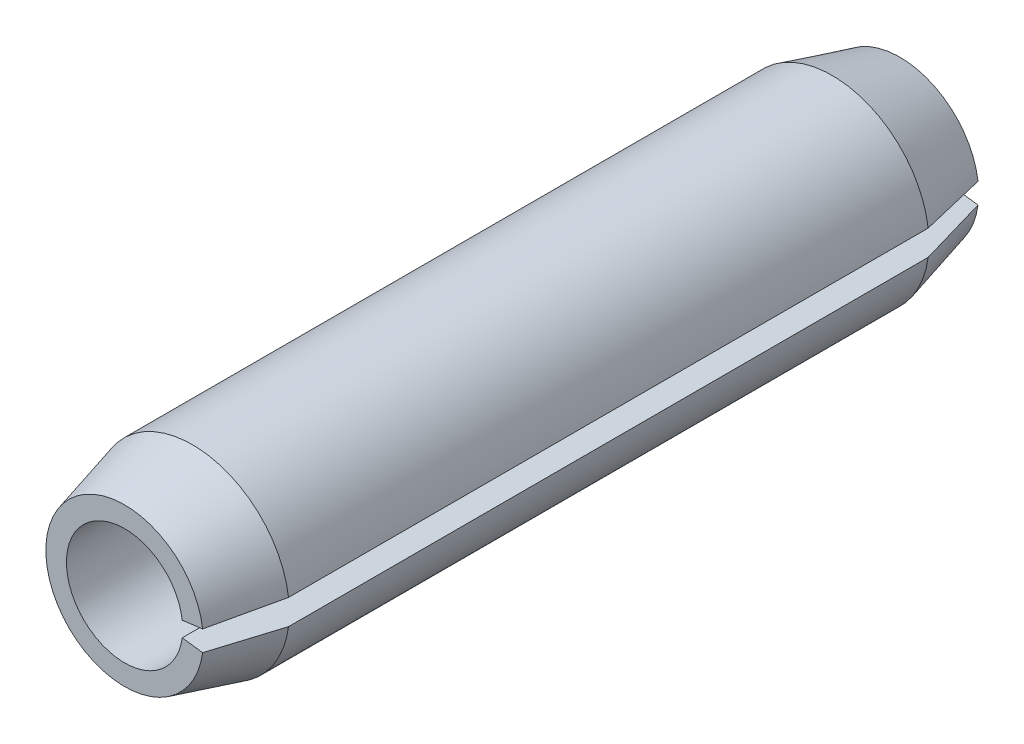
ISO-10303-21;
HEADER;
FILE_DESCRIPTION(('STEP AP214'),'2;1');
FILE_NAME('part.step','',(''),(''),'','','');
FILE_SCHEMA(('AUTOMOTIVE_DESIGN { 1 0 10303 214 1 1 1 1 }'));
ENDSEC;
DATA;
#1=APPLICATION_CONTEXT('core data for automotive mechanical design processes');
#2=APPLICATION_PROTOCOL_DEFINITION('international standard','automotive_design',2000,#1);
#3=PRODUCT_CONTEXT('',#1,'mechanical');
#4=PRODUCT('Part','Part','',(#3));
#5=PRODUCT_RELATED_PRODUCT_CATEGORY('part','',(#4));
#6=PRODUCT_DEFINITION_FORMATION('','',#4);
#7=PRODUCT_DEFINITION_CONTEXT('part definition',#1,'design');
#8=PRODUCT_DEFINITION('design','',#6,#7);
#9=PRODUCT_DEFINITION_SHAPE('','',#8);
#10=(LENGTH_UNIT() NAMED_UNIT(*) SI_UNIT(.MILLI.,.METRE.));
#11=(NAMED_UNIT(*) PLANE_ANGLE_UNIT() SI_UNIT($,.RADIAN.));
#12=(NAMED_UNIT(*) SI_UNIT($,.STERADIAN.) SOLID_ANGLE_UNIT());
#13=UNCERTAINTY_MEASURE_WITH_UNIT(LENGTH_MEASURE(1.E-05),#10,'distance_accuracy_value','');
#14=(GEOMETRIC_REPRESENTATION_CONTEXT(3) GLOBAL_UNCERTAINTY_ASSIGNED_CONTEXT((#13)) GLOBAL_UNIT_ASSIGNED_CONTEXT((#10,
#11,#12)) REPRESENTATION_CONTEXT('',''));
#15=CARTESIAN_POINT('',(0.,0.,0.));
#16=DIRECTION('',(0.,0.,1.));
#17=DIRECTION('',(1.,0.,0.));
#18=AXIS2_PLACEMENT_3D('',#15,#16,#17);
#19=CARTESIAN_POINT('',(0.,0.,2.));
#20=DIRECTION('',(0.,0.,1.));
#21=DIRECTION('',(1.,0.,0.));
#22=AXIS2_PLACEMENT_3D('',#19,#20,#21);
#23=PLANE('',#22);
#24=DIRECTION('',(0.991444861373811,-0.130526192220048,0.));
#25=VECTOR('',#24,1.);
#26=CARTESIAN_POINT('',(0.,0.,2.));
#27=LINE('',#26,#25);
#28=CARTESIAN_POINT('',(0.297433458412143,-0.0391578576660145,2.));
#29=VERTEX_POINT('',#28);
#30=CARTESIAN_POINT('',(0.402742533206121,-0.0530220603812592,2.));
#31=VERTEX_POINT('',#30);
#32=EDGE_CURVE('E43',#29,#31,#27,.T.);
#33=ORIENTED_EDGE('',*,*,#32,.F.);
#34=CARTESIAN_POINT('',(0.,0.,2.));
#35=DIRECTION('',(0.,0.,1.));
#36=DIRECTION('',(1.,0.,0.));
#37=AXIS2_PLACEMENT_3D('',#34,#35,#36);
#38=CIRCLE('',#37,0.3);
#39=CARTESIAN_POINT('',(0.297433458412143,0.0391578576660145,2.));
#40=VERTEX_POINT('',#39);
#41=EDGE_CURVE('E94',#40,#29,#38,.T.);
#42=ORIENTED_EDGE('',*,*,#41,.F.);
#43=DIRECTION('',(-0.991444861373811,-0.130526192220048,0.));
#44=VECTOR('',#43,1.);
#45=CARTESIAN_POINT('',(0.495722430686906,0.0652630961100242,2.));
#46=LINE('',#45,#44);
#47=CARTESIAN_POINT('',(0.402742533206121,0.0530220603812592,2.));
#48=VERTEX_POINT('',#47);
#49=EDGE_CURVE('E97',#48,#40,#46,.T.);
#50=ORIENTED_EDGE('',*,*,#49,.F.);
#51=CARTESIAN_POINT('',(0.,0.,2.));
#52=DIRECTION('',(0.,0.,1.));
#53=DIRECTION('',(1.,0.,0.));
#54=AXIS2_PLACEMENT_3D('',#51,#52,#53);
#55=CIRCLE('',#54,0.406217782649108);
#56=EDGE_CURVE('E96',#48,#31,#55,.T.);
#57=ORIENTED_EDGE('',*,*,#56,.T.);
#58=EDGE_LOOP('',(#33,#42,#50,#57));
#59=FACE_BOUND('',#58,.T.);
#60=ADVANCED_FACE('F29',(#59),#23,.T.);
#61=CARTESIAN_POINT('',(0.,0.,-2.));
#62=DIRECTION('',(0.,0.,1.));
#63=DIRECTION('',(1.,0.,0.));
#64=AXIS2_PLACEMENT_3D('',#61,#62,#63);
#65=PLANE('',#64);
#66=CARTESIAN_POINT('',(0.,0.,-2.));
#67=DIRECTION('',(0.,0.,1.));
#68=DIRECTION('',(1.,0.,0.));
#69=AXIS2_PLACEMENT_3D('',#66,#67,#68);
#70=CIRCLE('',#69,0.3);
#71=CARTESIAN_POINT('',(0.297433458412143,0.0391578576660145,-2.));
#72=VERTEX_POINT('',#71);
#73=CARTESIAN_POINT('',(0.297433458412143,-0.0391578576660145,-2.));
#74=VERTEX_POINT('',#73);
#75=EDGE_CURVE('E87',#72,#74,#70,.T.);
#76=ORIENTED_EDGE('',*,*,#75,.T.);
#77=DIRECTION('',(0.991444861373811,-0.130526192220048,0.));
#78=VECTOR('',#77,1.);
#79=CARTESIAN_POINT('',(0.,0.,-2.));
#80=LINE('',#79,#78);
#81=CARTESIAN_POINT('',(0.402742533206121,-0.0530220603812592,-2.));
#82=VERTEX_POINT('',#81);
#83=EDGE_CURVE('E82',#74,#82,#80,.T.);
#84=ORIENTED_EDGE('',*,*,#83,.T.);
#85=CARTESIAN_POINT('',(0.,0.,-2.));
#86=DIRECTION('',(0.,0.,1.));
#87=DIRECTION('',(1.,0.,0.));
#88=AXIS2_PLACEMENT_3D('',#85,#86,#87);
#89=CIRCLE('',#88,0.406217782649107);
#90=CARTESIAN_POINT('',(0.402742533206121,0.0530220603812592,-2.));
#91=VERTEX_POINT('',#90);
#92=EDGE_CURVE('E111',#82,#91,#89,.F.);
#93=ORIENTED_EDGE('',*,*,#92,.T.);
#94=DIRECTION('',(-0.991444861373811,-0.130526192220048,0.));
#95=VECTOR('',#94,1.);
#96=CARTESIAN_POINT('',(0.495722430686906,0.0652630961100242,-2.));
#97=LINE('',#96,#95);
#98=EDGE_CURVE('E124',#91,#72,#97,.T.);
#99=ORIENTED_EDGE('',*,*,#98,.T.);
#100=EDGE_LOOP('',(#76,#84,#93,#99));
#101=FACE_BOUND('',#100,.T.);
#102=ADVANCED_FACE('F136',(#101),#65,.F.);
#103=CARTESIAN_POINT('',(0.,0.,2.));
#104=DIRECTION('',(0.,0.,-1.));
#105=DIRECTION('',(-1.,0.,0.));
#106=AXIS2_PLACEMENT_3D('',#103,#104,#105);
#107=CYLINDRICAL_SURFACE('',#106,0.5);
#108=CARTESIAN_POINT('',(0.,0.,-1.65));
#109=DIRECTION('',(0.,0.,1.));
#110=DIRECTION('',(1.,0.,0.));
#111=AXIS2_PLACEMENT_3D('',#108,#109,#110);
#112=CIRCLE('',#111,0.5);
#113=CARTESIAN_POINT('',(0.495722430686906,0.0652630961100242,-1.64999999999999));
#114=VERTEX_POINT('',#113);
#115=CARTESIAN_POINT('',(0.495722430686906,-0.0652630961100242,-1.64999999999999));
#116=VERTEX_POINT('',#115);
#117=EDGE_CURVE('E105',#114,#116,#112,.T.);
#118=ORIENTED_EDGE('',*,*,#117,.T.);
#119=DIRECTION('',(0.,0.,1.));
#120=VECTOR('',#119,1.);
#121=CARTESIAN_POINT('',(0.495722430686906,-0.0652630961100242,-2.));
#122=LINE('',#121,#120);
#123=CARTESIAN_POINT('',(0.495722430686906,-0.0652630961100242,1.65));
#124=VERTEX_POINT('',#123);
#125=EDGE_CURVE('E120',#116,#124,#122,.T.);
#126=ORIENTED_EDGE('',*,*,#125,.T.);
#127=CARTESIAN_POINT('',(0.,0.,1.65));
#128=DIRECTION('',(0.,0.,1.));
#129=DIRECTION('',(1.,0.,0.));
#130=AXIS2_PLACEMENT_3D('',#127,#128,#129);
#131=CIRCLE('',#130,0.5);
#132=CARTESIAN_POINT('',(0.495722430686906,0.0652630961100242,1.65));
#133=VERTEX_POINT('',#132);
#134=EDGE_CURVE('E102',#124,#133,#131,.F.);
#135=ORIENTED_EDGE('',*,*,#134,.T.);
#136=DIRECTION('',(0.,0.,1.));
#137=VECTOR('',#136,1.);
#138=CARTESIAN_POINT('',(0.495722430686906,0.0652630961100242,-2.));
#139=LINE('',#138,#137);
#140=EDGE_CURVE('E51',#114,#133,#139,.T.);
#141=ORIENTED_EDGE('',*,*,#140,.F.);
#142=EDGE_LOOP('',(#118,#126,#135,#141));
#143=FACE_BOUND('',#142,.T.);
#144=ADVANCED_FACE('F31',(#143),#107,.T.);
#145=CARTESIAN_POINT('',(0.,0.,2.));
#146=DIRECTION('',(0.,0.,-1.));
#147=DIRECTION('',(-1.,0.,0.));
#148=AXIS2_PLACEMENT_3D('',#145,#146,#147);
#149=CYLINDRICAL_SURFACE('',#148,0.3);
#150=DIRECTION('',(0.,0.,-1.));
#151=VECTOR('',#150,1.);
#152=CARTESIAN_POINT('',(0.297433458412143,-0.0391578576660145,2.));
#153=LINE('',#152,#151);
#154=EDGE_CURVE('E79',#74,#29,#153,.F.);
#155=ORIENTED_EDGE('',*,*,#154,.F.);
#156=ORIENTED_EDGE('',*,*,#75,.F.);
#157=DIRECTION('',(0.,0.,-1.));
#158=VECTOR('',#157,1.);
#159=CARTESIAN_POINT('',(0.297433458412143,0.0391578576660145,2.));
#160=LINE('',#159,#158);
#161=EDGE_CURVE('E101',#40,#72,#160,.T.);
#162=ORIENTED_EDGE('',*,*,#161,.F.);
#163=ORIENTED_EDGE('',*,*,#41,.T.);
#164=EDGE_LOOP('',(#155,#156,#162,#163));
#165=FACE_BOUND('',#164,.T.);
#166=ADVANCED_FACE('F100',(#165),#149,.F.);
#167=CARTESIAN_POINT('',(0.,0.,-1.65));
#168=DIRECTION('',(0.,0.,1.));
#169=DIRECTION('',(1.,0.,0.));
#170=AXIS2_PLACEMENT_3D('',#167,#168,#169);
#171=CONICAL_SURFACE('',#170,0.5,0.261799387799147);
#172=DIRECTION('',(0.256604812292568,-0.0337826644312607,0.965925826289069));
#173=VECTOR('',#172,1.);
#174=CARTESIAN_POINT('',(0.,0.,-3.51602540378445));
#175=LINE('',#174,#173);
#176=EDGE_CURVE('E88',#116,#82,#175,.F.);
#177=ORIENTED_EDGE('',*,*,#176,.F.);
#178=ORIENTED_EDGE('',*,*,#117,.F.);
#179=DIRECTION('',(-0.256604812292568,-0.0337826644312607,-0.965925826289069));
#180=VECTOR('',#179,1.);
#181=CARTESIAN_POINT('',(0.,0.,-3.51602540378445));
#182=LINE('',#181,#180);
#183=EDGE_CURVE('E126',#91,#114,#182,.F.);
#184=ORIENTED_EDGE('',*,*,#183,.F.);
#185=ORIENTED_EDGE('',*,*,#92,.F.);
#186=EDGE_LOOP('',(#177,#178,#184,#185));
#187=FACE_BOUND('',#186,.T.);
#188=ADVANCED_FACE('F139',(#187),#171,.T.);
#189=CARTESIAN_POINT('',(0.,0.,2.));
#190=DIRECTION('',(0.,0.,-1.));
#191=DIRECTION('',(-1.,0.,0.));
#192=AXIS2_PLACEMENT_3D('',#189,#190,#191);
#193=CONICAL_SURFACE('',#192,0.406217782649108,0.261799387799147);
#194=DIRECTION('',(-0.256604812292568,0.0337826644312607,0.965925826289069));
#195=VECTOR('',#194,1.);
#196=CARTESIAN_POINT('',(0.,0.,3.51602540378446));
#197=LINE('',#196,#195);
#198=EDGE_CURVE('E11',#31,#124,#197,.F.);
#199=ORIENTED_EDGE('',*,*,#198,.F.);
#200=ORIENTED_EDGE('',*,*,#56,.F.);
#201=DIRECTION('',(0.256604812292568,0.0337826644312607,-0.965925826289069));
#202=VECTOR('',#201,1.);
#203=CARTESIAN_POINT('',(0.,0.,3.51602540378446));
#204=LINE('',#203,#202);
#205=EDGE_CURVE('E37',#133,#48,#204,.F.);
#206=ORIENTED_EDGE('',*,*,#205,.F.);
#207=ORIENTED_EDGE('',*,*,#134,.F.);
#208=EDGE_LOOP('',(#199,#200,#206,#207));
#209=FACE_BOUND('',#208,.T.);
#210=ADVANCED_FACE('F118',(#209),#193,.T.);
#211=CARTESIAN_POINT('',(0.495722430686906,0.0652630961100242,-2.));
#212=DIRECTION('',(-0.130526192220048,0.991444861373811,0.));
#213=DIRECTION('',(-0.991444861373811,-0.130526192220048,0.));
#214=AXIS2_PLACEMENT_3D('',#211,#212,#213);
#215=PLANE('',#214);
#216=ORIENTED_EDGE('',*,*,#161,.T.);
#217=ORIENTED_EDGE('',*,*,#98,.F.);
#218=ORIENTED_EDGE('',*,*,#183,.T.);
#219=ORIENTED_EDGE('',*,*,#140,.T.);
#220=ORIENTED_EDGE('',*,*,#205,.T.);
#221=ORIENTED_EDGE('',*,*,#49,.T.);
#222=EDGE_LOOP('',(#216,#217,#218,#219,#220,#221));
#223=FACE_BOUND('',#222,.T.);
#224=ADVANCED_FACE('F114',(#223),#215,.F.);
#225=CARTESIAN_POINT('',(0.,0.,-2.));
#226=DIRECTION('',(-0.130526192220048,-0.991444861373811,0.));
#227=DIRECTION('',(0.991444861373811,-0.130526192220048,0.));
#228=AXIS2_PLACEMENT_3D('',#225,#226,#227);
#229=PLANE('',#228);
#230=ORIENTED_EDGE('',*,*,#154,.T.);
#231=ORIENTED_EDGE('',*,*,#32,.T.);
#232=ORIENTED_EDGE('',*,*,#198,.T.);
#233=ORIENTED_EDGE('',*,*,#125,.F.);
#234=ORIENTED_EDGE('',*,*,#176,.T.);
#235=ORIENTED_EDGE('',*,*,#83,.F.);
#236=EDGE_LOOP('',(#230,#231,#232,#233,#234,#235));
#237=FACE_BOUND('',#236,.T.);
#238=ADVANCED_FACE('F80',(#237),#229,.F.);
#239=CLOSED_SHELL('',(#60,#102,#144,#166,#188,#210,#224,#238));
#240=MANIFOLD_SOLID_BREP('B2',#239);
#241=ADVANCED_BREP_SHAPE_REPRESENTATION('',(#18,#240),#14);
#242=SHAPE_DEFINITION_REPRESENTATION(#9,#241);
ENDSEC;
END-ISO-10303-21;
